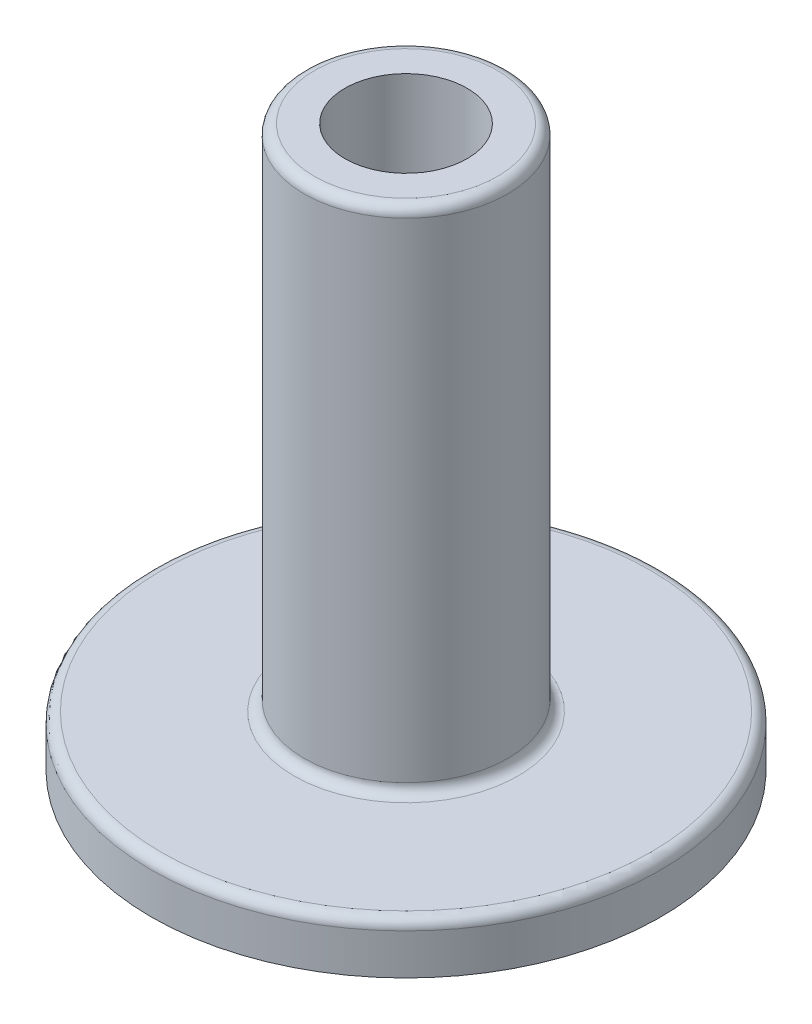
ISO-10303-21;
HEADER;
FILE_DESCRIPTION(('STEP AP214'),'2;1');
FILE_NAME('part.step','',(''),(''),'','','');
FILE_SCHEMA(('AUTOMOTIVE_DESIGN { 1 0 10303 214 1 1 1 1 }'));
ENDSEC;
DATA;
#1=APPLICATION_CONTEXT('core data for automotive mechanical design processes');
#2=APPLICATION_PROTOCOL_DEFINITION('international standard','automotive_design',2000,#1);
#3=PRODUCT_CONTEXT('',#1,'mechanical');
#4=PRODUCT('Part','Part','',(#3));
#5=PRODUCT_RELATED_PRODUCT_CATEGORY('part','',(#4));
#6=PRODUCT_DEFINITION_FORMATION('','',#4);
#7=PRODUCT_DEFINITION_CONTEXT('part definition',#1,'design');
#8=PRODUCT_DEFINITION('design','',#6,#7);
#9=PRODUCT_DEFINITION_SHAPE('','',#8);
#10=(LENGTH_UNIT() NAMED_UNIT(*) SI_UNIT(.MILLI.,.METRE.));
#11=(NAMED_UNIT(*) PLANE_ANGLE_UNIT() SI_UNIT($,.RADIAN.));
#12=(NAMED_UNIT(*) SI_UNIT($,.STERADIAN.) SOLID_ANGLE_UNIT());
#13=UNCERTAINTY_MEASURE_WITH_UNIT(LENGTH_MEASURE(1.E-05),#10,'distance_accuracy_value','');
#14=(GEOMETRIC_REPRESENTATION_CONTEXT(3) GLOBAL_UNCERTAINTY_ASSIGNED_CONTEXT((#13)) GLOBAL_UNIT_ASSIGNED_CONTEXT((#10,
#11,#12)) REPRESENTATION_CONTEXT('',''));
#15=CARTESIAN_POINT('',(0.,0.,0.));
#16=DIRECTION('',(0.,0.,1.));
#17=DIRECTION('',(1.,0.,0.));
#18=AXIS2_PLACEMENT_3D('',#15,#16,#17);
#19=CARTESIAN_POINT('',(0.,5.,0.));
#20=DIRECTION('',(0.,-1.,0.));
#21=DIRECTION('',(0.,0.,-1.));
#22=AXIS2_PLACEMENT_3D('',#19,#20,#21);
#23=CYLINDRICAL_SURFACE('',#22,25.);
#24=CARTESIAN_POINT('',(0.,4.,0.));
#25=DIRECTION('',(0.,1.,0.));
#26=DIRECTION('',(0.,0.,1.));
#27=AXIS2_PLACEMENT_3D('',#24,#25,#26);
#28=CIRCLE('',#27,25.);
#29=CARTESIAN_POINT('',(0.,4.,25.));
#30=VERTEX_POINT('',#29);
#31=EDGE_CURVE('E46',#30,#30,#28,.F.);
#32=ORIENTED_EDGE('',*,*,#31,.T.);
#33=EDGE_LOOP('',(#32));
#34=FACE_BOUND('',#33,.T.);
#35=CARTESIAN_POINT('',(0.,0.,0.));
#36=DIRECTION('',(0.,1.,0.));
#37=DIRECTION('',(0.,0.,1.));
#38=AXIS2_PLACEMENT_3D('',#35,#36,#37);
#39=CIRCLE('',#38,25.);
#40=CARTESIAN_POINT('',(0.,0.,25.));
#41=VERTEX_POINT('',#40);
#42=EDGE_CURVE('E60',#41,#41,#39,.T.);
#43=ORIENTED_EDGE('',*,*,#42,.T.);
#44=EDGE_LOOP('',(#43));
#45=FACE_BOUND('',#44,.T.);
#46=ADVANCED_FACE('F31',(#34,#45),#23,.T.);
#47=CARTESIAN_POINT('',(0.,5.,0.));
#48=DIRECTION('',(0.,1.,0.));
#49=DIRECTION('',(0.,0.,1.));
#50=AXIS2_PLACEMENT_3D('',#47,#48,#49);
#51=PLANE('',#50);
#52=CARTESIAN_POINT('',(0.,5.,0.));
#53=DIRECTION('',(0.,1.,0.));
#54=DIRECTION('',(0.,0.,1.));
#55=AXIS2_PLACEMENT_3D('',#52,#53,#54);
#56=CIRCLE('',#55,24.);
#57=CARTESIAN_POINT('',(0.,5.,24.));
#58=VERTEX_POINT('',#57);
#59=EDGE_CURVE('E51',#58,#58,#56,.T.);
#60=ORIENTED_EDGE('',*,*,#59,.T.);
#61=EDGE_LOOP('',(#60));
#62=FACE_BOUND('',#61,.T.);
#63=CARTESIAN_POINT('',(0.,5.,0.));
#64=DIRECTION('',(0.,1.,0.));
#65=DIRECTION('',(0.,0.,1.));
#66=AXIS2_PLACEMENT_3D('',#63,#64,#65);
#67=CIRCLE('',#66,11.);
#68=CARTESIAN_POINT('',(0.,5.,11.));
#69=VERTEX_POINT('',#68);
#70=EDGE_CURVE('E54',#69,#69,#67,.F.);
#71=ORIENTED_EDGE('',*,*,#70,.T.);
#72=EDGE_LOOP('',(#71));
#73=FACE_BOUND('',#72,.T.);
#74=ADVANCED_FACE('F80',(#62,#73),#51,.T.);
#75=CARTESIAN_POINT('',(0.,0.,0.));
#76=DIRECTION('',(0.,1.,0.));
#77=DIRECTION('',(0.,0.,1.));
#78=AXIS2_PLACEMENT_3D('',#75,#76,#77);
#79=PLANE('',#78);
#80=ORIENTED_EDGE('',*,*,#42,.F.);
#81=EDGE_LOOP('',(#80));
#82=FACE_BOUND('',#81,.T.);
#83=ADVANCED_FACE('F73',(#82),#79,.F.);
#84=CARTESIAN_POINT('',(0.,55.,0.));
#85=DIRECTION('',(0.,1.,0.));
#86=DIRECTION('',(0.,0.,1.));
#87=AXIS2_PLACEMENT_3D('',#84,#85,#86);
#88=PLANE('',#87);
#89=CARTESIAN_POINT('',(0.,55.,0.));
#90=DIRECTION('',(0.,1.,0.));
#91=DIRECTION('',(0.,0.,1.));
#92=AXIS2_PLACEMENT_3D('',#89,#90,#91);
#93=CIRCLE('',#92,9.);
#94=CARTESIAN_POINT('',(0.,55.,9.));
#95=VERTEX_POINT('',#94);
#96=EDGE_CURVE('E10',#95,#95,#93,.T.);
#97=ORIENTED_EDGE('',*,*,#96,.T.);
#98=EDGE_LOOP('',(#97));
#99=FACE_BOUND('',#98,.T.);
#100=CARTESIAN_POINT('',(0.,55.,0.));
#101=DIRECTION('',(0.,1.,0.));
#102=DIRECTION('',(0.,0.,1.));
#103=AXIS2_PLACEMENT_3D('',#100,#101,#102);
#104=CIRCLE('',#103,6.);
#105=CARTESIAN_POINT('',(0.,55.,6.));
#106=VERTEX_POINT('',#105);
#107=EDGE_CURVE('E63',#106,#106,#104,.T.);
#108=ORIENTED_EDGE('',*,*,#107,.F.);
#109=EDGE_LOOP('',(#108));
#110=FACE_BOUND('',#109,.T.);
#111=ADVANCED_FACE('F70',(#99,#110),#88,.T.);
#112=CARTESIAN_POINT('',(0.,55.,0.));
#113=DIRECTION('',(0.,-1.,0.));
#114=DIRECTION('',(0.,0.,-1.));
#115=AXIS2_PLACEMENT_3D('',#112,#113,#114);
#116=CYLINDRICAL_SURFACE('',#115,10.);
#117=CARTESIAN_POINT('',(0.,6.,0.));
#118=DIRECTION('',(0.,1.,0.));
#119=DIRECTION('',(0.,0.,1.));
#120=AXIS2_PLACEMENT_3D('',#117,#118,#119);
#121=CIRCLE('',#120,10.);
#122=CARTESIAN_POINT('',(0.,6.,10.));
#123=VERTEX_POINT('',#122);
#124=EDGE_CURVE('E38',#123,#123,#121,.T.);
#125=ORIENTED_EDGE('',*,*,#124,.T.);
#126=EDGE_LOOP('',(#125));
#127=FACE_BOUND('',#126,.T.);
#128=CARTESIAN_POINT('',(0.,54.,0.));
#129=DIRECTION('',(0.,1.,0.));
#130=DIRECTION('',(0.,0.,1.));
#131=AXIS2_PLACEMENT_3D('',#128,#129,#130);
#132=CIRCLE('',#131,10.);
#133=CARTESIAN_POINT('',(0.,54.,10.));
#134=VERTEX_POINT('',#133);
#135=EDGE_CURVE('E42',#134,#134,#132,.F.);
#136=ORIENTED_EDGE('',*,*,#135,.T.);
#137=EDGE_LOOP('',(#136));
#138=FACE_BOUND('',#137,.T.);
#139=ADVANCED_FACE('F72',(#127,#138),#116,.T.);
#140=CARTESIAN_POINT('',(0.,55.,0.));
#141=DIRECTION('',(0.,-1.,0.));
#142=DIRECTION('',(0.,0.,-1.));
#143=AXIS2_PLACEMENT_3D('',#140,#141,#142);
#144=CYLINDRICAL_SURFACE('',#143,6.);
#145=ORIENTED_EDGE('',*,*,#107,.T.);
#146=EDGE_LOOP('',(#145));
#147=FACE_BOUND('',#146,.T.);
#148=CARTESIAN_POINT('',(0.,5.,0.));
#149=DIRECTION('',(0.,1.,0.));
#150=DIRECTION('',(0.,0.,1.));
#151=AXIS2_PLACEMENT_3D('',#148,#149,#150);
#152=CIRCLE('',#151,6.);
#153=CARTESIAN_POINT('',(0.,5.,6.));
#154=VERTEX_POINT('',#153);
#155=EDGE_CURVE('E57',#154,#154,#152,.F.);
#156=ORIENTED_EDGE('',*,*,#155,.T.);
#157=EDGE_LOOP('',(#156));
#158=FACE_BOUND('',#157,.T.);
#159=ADVANCED_FACE('F67',(#147,#158),#144,.F.);
#160=ORIENTED_EDGE('',*,*,#155,.F.);
#161=EDGE_LOOP('',(#160));
#162=FACE_BOUND('',#161,.T.);
#163=ADVANCED_FACE('F92',(#162),#51,.T.);
#164=CARTESIAN_POINT('',(0.,4.,0.));
#165=DIRECTION('',(0.,1.,0.));
#166=DIRECTION('',(0.,0.,1.));
#167=AXIS2_PLACEMENT_3D('',#164,#165,#166);
#168=TOROIDAL_SURFACE('',#167,24.,1.);
#169=ORIENTED_EDGE('',*,*,#31,.F.);
#170=EDGE_LOOP('',(#169));
#171=FACE_BOUND('',#170,.T.);
#172=ORIENTED_EDGE('',*,*,#59,.F.);
#173=EDGE_LOOP('',(#172));
#174=FACE_BOUND('',#173,.T.);
#175=ADVANCED_FACE('F95',(#171,#174),#168,.T.);
#176=CARTESIAN_POINT('',(0.,6.,0.));
#177=DIRECTION('',(0.,1.,0.));
#178=DIRECTION('',(0.,0.,1.));
#179=AXIS2_PLACEMENT_3D('',#176,#177,#178);
#180=TOROIDAL_SURFACE('',#179,11.,1.);
#181=ORIENTED_EDGE('',*,*,#70,.F.);
#182=EDGE_LOOP('',(#181));
#183=FACE_BOUND('',#182,.T.);
#184=ORIENTED_EDGE('',*,*,#124,.F.);
#185=EDGE_LOOP('',(#184));
#186=FACE_BOUND('',#185,.T.);
#187=ADVANCED_FACE('F97',(#183,#186),#180,.F.);
#188=CARTESIAN_POINT('',(0.,54.,0.));
#189=DIRECTION('',(0.,1.,0.));
#190=DIRECTION('',(0.,0.,1.));
#191=AXIS2_PLACEMENT_3D('',#188,#189,#190);
#192=TOROIDAL_SURFACE('',#191,9.,1.);
#193=ORIENTED_EDGE('',*,*,#135,.F.);
#194=EDGE_LOOP('',(#193));
#195=FACE_BOUND('',#194,.T.);
#196=ORIENTED_EDGE('',*,*,#96,.F.);
#197=EDGE_LOOP('',(#196));
#198=FACE_BOUND('',#197,.T.);
#199=ADVANCED_FACE('F33',(#195,#198),#192,.T.);
#200=CLOSED_SHELL('',(#46,#74,#83,#111,#139,#159,#163,#175,#187,#199));
#201=MANIFOLD_SOLID_BREP('B2',#200);
#202=ADVANCED_BREP_SHAPE_REPRESENTATION('',(#18,#201),#14);
#203=SHAPE_DEFINITION_REPRESENTATION(#9,#202);
ENDSEC;
END-ISO-10303-21;
